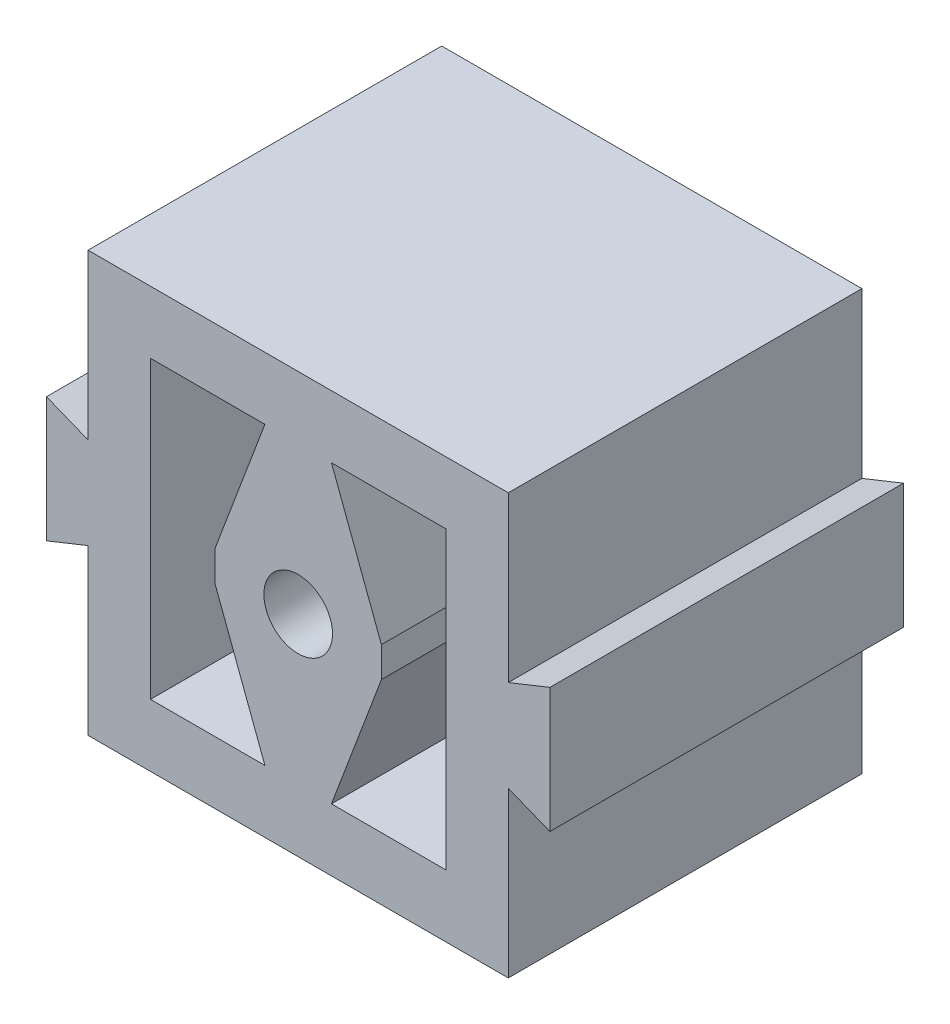
ISO-10303-21;
HEADER;
FILE_DESCRIPTION(('STEP AP214'),'2;1');
FILE_NAME('part.step','',(''),(''),'','','');
FILE_SCHEMA(('AUTOMOTIVE_DESIGN { 1 0 10303 214 1 1 1 1 }'));
ENDSEC;
DATA;
#1=APPLICATION_CONTEXT('core data for automotive mechanical design processes');
#2=APPLICATION_PROTOCOL_DEFINITION('international standard','automotive_design',2000,#1);
#3=PRODUCT_CONTEXT('',#1,'mechanical');
#4=PRODUCT('Part','Part','',(#3));
#5=PRODUCT_RELATED_PRODUCT_CATEGORY('part','',(#4));
#6=PRODUCT_DEFINITION_FORMATION('','',#4);
#7=PRODUCT_DEFINITION_CONTEXT('part definition',#1,'design');
#8=PRODUCT_DEFINITION('design','',#6,#7);
#9=PRODUCT_DEFINITION_SHAPE('','',#8);
#10=(LENGTH_UNIT() NAMED_UNIT(*) SI_UNIT(.MILLI.,.METRE.));
#11=(NAMED_UNIT(*) PLANE_ANGLE_UNIT() SI_UNIT($,.RADIAN.));
#12=(NAMED_UNIT(*) SI_UNIT($,.STERADIAN.) SOLID_ANGLE_UNIT());
#13=UNCERTAINTY_MEASURE_WITH_UNIT(LENGTH_MEASURE(1.E-05),#10,'distance_accuracy_value','');
#14=(GEOMETRIC_REPRESENTATION_CONTEXT(3) GLOBAL_UNCERTAINTY_ASSIGNED_CONTEXT((#13)) GLOBAL_UNIT_ASSIGNED_CONTEXT((#10,
#11,#12)) REPRESENTATION_CONTEXT('',''));
#15=CARTESIAN_POINT('',(0.,0.,0.));
#16=DIRECTION('',(0.,0.,1.));
#17=DIRECTION('',(1.,0.,0.));
#18=AXIS2_PLACEMENT_3D('',#15,#16,#17);
#19=CARTESIAN_POINT('',(25.25,0.,42.5));
#20=DIRECTION('',(1.,0.,0.));
#21=DIRECTION('',(0.,0.,-1.));
#22=AXIS2_PLACEMENT_3D('',#19,#20,#21);
#23=PLANE('',#22);
#24=DIRECTION('',(0.,-1.,0.));
#25=VECTOR('',#24,1.);
#26=CARTESIAN_POINT('',(25.25,0.,0.));
#27=LINE('',#26,#25);
#28=CARTESIAN_POINT('',(25.25,25.25,0.));
#29=VERTEX_POINT('',#28);
#30=CARTESIAN_POINT('',(25.25,5.5,0.));
#31=VERTEX_POINT('',#30);
#32=EDGE_CURVE('E348',#29,#31,#27,.T.);
#33=ORIENTED_EDGE('',*,*,#32,.F.);
#34=DIRECTION('',(0.,0.,-1.));
#35=VECTOR('',#34,1.);
#36=CARTESIAN_POINT('',(25.25,25.25,42.5));
#37=LINE('',#36,#35);
#38=CARTESIAN_POINT('',(25.25,25.25,42.5));
#39=VERTEX_POINT('',#38);
#40=EDGE_CURVE('E422',#39,#29,#37,.T.);
#41=ORIENTED_EDGE('',*,*,#40,.F.);
#42=DIRECTION('',(0.,-1.,0.));
#43=VECTOR('',#42,1.);
#44=CARTESIAN_POINT('',(25.25,0.,42.5));
#45=LINE('',#44,#43);
#46=CARTESIAN_POINT('',(25.25,5.5,42.5));
#47=VERTEX_POINT('',#46);
#48=EDGE_CURVE('E309',#39,#47,#45,.T.);
#49=ORIENTED_EDGE('',*,*,#48,.T.);
#50=DIRECTION('',(0.,0.,-1.));
#51=VECTOR('',#50,1.);
#52=CARTESIAN_POINT('',(25.25,5.5,42.5));
#53=LINE('',#52,#51);
#54=EDGE_CURVE('E347',#47,#31,#53,.T.);
#55=ORIENTED_EDGE('',*,*,#54,.T.);
#56=EDGE_LOOP('',(#33,#41,#49,#55));
#57=FACE_BOUND('',#56,.T.);
#58=ADVANCED_FACE('F47',(#57),#23,.T.);
#59=CARTESIAN_POINT('',(0.,25.25,42.5));
#60=DIRECTION('',(0.,1.,0.));
#61=DIRECTION('',(0.,0.,1.));
#62=AXIS2_PLACEMENT_3D('',#59,#60,#61);
#63=PLANE('',#62);
#64=DIRECTION('',(1.,0.,0.));
#65=VECTOR('',#64,1.);
#66=CARTESIAN_POINT('',(0.,25.25,0.));
#67=LINE('',#66,#65);
#68=CARTESIAN_POINT('',(-25.25,25.25,0.));
#69=VERTEX_POINT('',#68);
#70=EDGE_CURVE('E352',#69,#29,#67,.T.);
#71=ORIENTED_EDGE('',*,*,#70,.F.);
#72=DIRECTION('',(0.,0.,-1.));
#73=VECTOR('',#72,1.);
#74=CARTESIAN_POINT('',(-25.25,25.25,42.5));
#75=LINE('',#74,#73);
#76=CARTESIAN_POINT('',(-25.25,25.25,42.5));
#77=VERTEX_POINT('',#76);
#78=EDGE_CURVE('E419',#77,#69,#75,.T.);
#79=ORIENTED_EDGE('',*,*,#78,.F.);
#80=DIRECTION('',(1.,0.,0.));
#81=VECTOR('',#80,1.);
#82=CARTESIAN_POINT('',(0.,25.25,42.5));
#83=LINE('',#82,#81);
#84=EDGE_CURVE('E313',#77,#39,#83,.T.);
#85=ORIENTED_EDGE('',*,*,#84,.T.);
#86=ORIENTED_EDGE('',*,*,#40,.T.);
#87=EDGE_LOOP('',(#71,#79,#85,#86));
#88=FACE_BOUND('',#87,.T.);
#89=ADVANCED_FACE('F49',(#88),#63,.T.);
#90=CARTESIAN_POINT('',(-25.25,0.,42.5));
#91=DIRECTION('',(1.,0.,0.));
#92=DIRECTION('',(0.,0.,-1.));
#93=AXIS2_PLACEMENT_3D('',#90,#91,#92);
#94=PLANE('',#93);
#95=DIRECTION('',(0.,-1.,0.));
#96=VECTOR('',#95,1.);
#97=CARTESIAN_POINT('',(-25.25,0.,0.));
#98=LINE('',#97,#96);
#99=CARTESIAN_POINT('',(-25.25,5.5,0.));
#100=VERTEX_POINT('',#99);
#101=EDGE_CURVE('E357',#69,#100,#98,.T.);
#102=ORIENTED_EDGE('',*,*,#101,.T.);
#103=DIRECTION('',(0.,0.,-1.));
#104=VECTOR('',#103,1.);
#105=CARTESIAN_POINT('',(-25.25,5.5,42.5));
#106=LINE('',#105,#104);
#107=CARTESIAN_POINT('',(-25.25,5.5,42.5));
#108=VERTEX_POINT('',#107);
#109=EDGE_CURVE('E415',#108,#100,#106,.T.);
#110=ORIENTED_EDGE('',*,*,#109,.F.);
#111=DIRECTION('',(0.,-1.,0.));
#112=VECTOR('',#111,1.);
#113=CARTESIAN_POINT('',(-25.25,0.,42.5));
#114=LINE('',#113,#112);
#115=EDGE_CURVE('E319',#77,#108,#114,.T.);
#116=ORIENTED_EDGE('',*,*,#115,.F.);
#117=ORIENTED_EDGE('',*,*,#78,.T.);
#118=EDGE_LOOP('',(#102,#110,#116,#117));
#119=FACE_BOUND('',#118,.T.);
#120=ADVANCED_FACE('F501',(#119),#94,.F.);
#121=CARTESIAN_POINT('',(-1.58620689655175,-3.96551724137935,42.5));
#122=DIRECTION('',(-0.371390676354105,-0.928476690885259,0.));
#123=DIRECTION('',(0.928476690885259,-0.371390676354105,0.));
#124=AXIS2_PLACEMENT_3D('',#121,#122,#123);
#125=PLANE('',#124);
#126=DIRECTION('',(-0.928476690885259,0.371390676354105,0.));
#127=VECTOR('',#126,1.);
#128=CARTESIAN_POINT('',(-1.58620689655175,-3.96551724137935,0.));
#129=LINE('',#128,#127);
#130=CARTESIAN_POINT('',(-30.25,7.50000000000001,0.));
#131=VERTEX_POINT('',#130);
#132=EDGE_CURVE('E360',#100,#131,#129,.T.);
#133=ORIENTED_EDGE('',*,*,#132,.T.);
#134=DIRECTION('',(0.,0.,-1.));
#135=VECTOR('',#134,1.);
#136=CARTESIAN_POINT('',(-30.25,7.50000000000001,42.5));
#137=LINE('',#136,#135);
#138=CARTESIAN_POINT('',(-30.25,7.50000000000001,42.5));
#139=VERTEX_POINT('',#138);
#140=EDGE_CURVE('E411',#139,#131,#137,.T.);
#141=ORIENTED_EDGE('',*,*,#140,.F.);
#142=DIRECTION('',(-0.928476690885259,0.371390676354105,0.));
#143=VECTOR('',#142,1.);
#144=CARTESIAN_POINT('',(-1.58620689655175,-3.96551724137935,42.5));
#145=LINE('',#144,#143);
#146=EDGE_CURVE('E322',#108,#139,#145,.T.);
#147=ORIENTED_EDGE('',*,*,#146,.F.);
#148=ORIENTED_EDGE('',*,*,#109,.T.);
#149=EDGE_LOOP('',(#133,#141,#147,#148));
#150=FACE_BOUND('',#149,.T.);
#151=ADVANCED_FACE('F548',(#150),#125,.F.);
#152=CARTESIAN_POINT('',(-30.25,0.,42.5));
#153=DIRECTION('',(1.,0.,0.));
#154=DIRECTION('',(0.,0.,-1.));
#155=AXIS2_PLACEMENT_3D('',#152,#153,#154);
#156=PLANE('',#155);
#157=DIRECTION('',(0.,-1.,0.));
#158=VECTOR('',#157,1.);
#159=CARTESIAN_POINT('',(-30.25,0.,0.));
#160=LINE('',#159,#158);
#161=CARTESIAN_POINT('',(-30.25,-7.49999999999999,0.));
#162=VERTEX_POINT('',#161);
#163=EDGE_CURVE('E364',#131,#162,#160,.T.);
#164=ORIENTED_EDGE('',*,*,#163,.T.);
#165=DIRECTION('',(0.,0.,-1.));
#166=VECTOR('',#165,1.);
#167=CARTESIAN_POINT('',(-30.25,-7.49999999999999,42.5));
#168=LINE('',#167,#166);
#169=CARTESIAN_POINT('',(-30.25,-7.49999999999999,42.5));
#170=VERTEX_POINT('',#169);
#171=EDGE_CURVE('E407',#170,#162,#168,.T.);
#172=ORIENTED_EDGE('',*,*,#171,.F.);
#173=DIRECTION('',(0.,-1.,0.));
#174=VECTOR('',#173,1.);
#175=CARTESIAN_POINT('',(-30.25,0.,42.5));
#176=LINE('',#175,#174);
#177=EDGE_CURVE('E326',#139,#170,#176,.T.);
#178=ORIENTED_EDGE('',*,*,#177,.F.);
#179=ORIENTED_EDGE('',*,*,#140,.T.);
#180=EDGE_LOOP('',(#164,#172,#178,#179));
#181=FACE_BOUND('',#180,.T.);
#182=ADVANCED_FACE('F552',(#181),#156,.F.);
#183=CARTESIAN_POINT('',(-1.58620689655177,3.9655172413794,42.5));
#184=DIRECTION('',(-0.371390676354107,0.928476690885258,0.));
#185=DIRECTION('',(-0.928476690885258,-0.371390676354107,0.));
#186=AXIS2_PLACEMENT_3D('',#183,#184,#185);
#187=PLANE('',#186);
#188=DIRECTION('',(0.928476690885258,0.371390676354107,0.));
#189=VECTOR('',#188,1.);
#190=CARTESIAN_POINT('',(-1.58620689655177,3.9655172413794,0.));
#191=LINE('',#190,#189);
#192=CARTESIAN_POINT('',(-25.25,-5.49999999999998,0.));
#193=VERTEX_POINT('',#192);
#194=EDGE_CURVE('E367',#162,#193,#191,.T.);
#195=ORIENTED_EDGE('',*,*,#194,.T.);
#196=DIRECTION('',(0.,0.,-1.));
#197=VECTOR('',#196,1.);
#198=CARTESIAN_POINT('',(-25.25,-5.49999999999998,42.5));
#199=LINE('',#198,#197);
#200=CARTESIAN_POINT('',(-25.25,-5.49999999999998,42.5));
#201=VERTEX_POINT('',#200);
#202=EDGE_CURVE('E403',#201,#193,#199,.T.);
#203=ORIENTED_EDGE('',*,*,#202,.F.);
#204=DIRECTION('',(0.928476690885258,0.371390676354107,0.));
#205=VECTOR('',#204,1.);
#206=CARTESIAN_POINT('',(-1.58620689655177,3.9655172413794,42.5));
#207=LINE('',#206,#205);
#208=EDGE_CURVE('E329',#170,#201,#207,.T.);
#209=ORIENTED_EDGE('',*,*,#208,.F.);
#210=ORIENTED_EDGE('',*,*,#171,.T.);
#211=EDGE_LOOP('',(#195,#203,#209,#210));
#212=FACE_BOUND('',#211,.T.);
#213=ADVANCED_FACE('F557',(#212),#187,.F.);
#214=CARTESIAN_POINT('',(-25.25,-25.25,0.));
#215=VERTEX_POINT('',#214);
#216=EDGE_CURVE('E361',#193,#215,#98,.T.);
#217=ORIENTED_EDGE('',*,*,#216,.T.);
#218=DIRECTION('',(0.,0.,-1.));
#219=VECTOR('',#218,1.);
#220=CARTESIAN_POINT('',(-25.25,-25.25,42.5));
#221=LINE('',#220,#219);
#222=CARTESIAN_POINT('',(-25.25,-25.25,42.5));
#223=VERTEX_POINT('',#222);
#224=EDGE_CURVE('E399',#223,#215,#221,.T.);
#225=ORIENTED_EDGE('',*,*,#224,.F.);
#226=EDGE_CURVE('E323',#201,#223,#114,.T.);
#227=ORIENTED_EDGE('',*,*,#226,.F.);
#228=ORIENTED_EDGE('',*,*,#202,.T.);
#229=EDGE_LOOP('',(#217,#225,#227,#228));
#230=FACE_BOUND('',#229,.T.);
#231=ADVANCED_FACE('F516',(#230),#94,.F.);
#232=CARTESIAN_POINT('',(0.,-25.25,42.5));
#233=DIRECTION('',(0.,1.,0.));
#234=DIRECTION('',(0.,0.,1.));
#235=AXIS2_PLACEMENT_3D('',#232,#233,#234);
#236=PLANE('',#235);
#237=DIRECTION('',(1.,0.,0.));
#238=VECTOR('',#237,1.);
#239=CARTESIAN_POINT('',(0.,-25.25,0.));
#240=LINE('',#239,#238);
#241=CARTESIAN_POINT('',(25.25,-25.25,0.));
#242=VERTEX_POINT('',#241);
#243=EDGE_CURVE('E370',#215,#242,#240,.T.);
#244=ORIENTED_EDGE('',*,*,#243,.T.);
#245=DIRECTION('',(0.,0.,-1.));
#246=VECTOR('',#245,1.);
#247=CARTESIAN_POINT('',(25.25,-25.25,42.5));
#248=LINE('',#247,#246);
#249=CARTESIAN_POINT('',(25.25,-25.25,42.5));
#250=VERTEX_POINT('',#249);
#251=EDGE_CURVE('E396',#250,#242,#248,.T.);
#252=ORIENTED_EDGE('',*,*,#251,.F.);
#253=DIRECTION('',(1.,0.,0.));
#254=VECTOR('',#253,1.);
#255=CARTESIAN_POINT('',(0.,-25.25,42.5));
#256=LINE('',#255,#254);
#257=EDGE_CURVE('E332',#223,#250,#256,.T.);
#258=ORIENTED_EDGE('',*,*,#257,.F.);
#259=ORIENTED_EDGE('',*,*,#224,.T.);
#260=EDGE_LOOP('',(#244,#252,#258,#259));
#261=FACE_BOUND('',#260,.T.);
#262=ADVANCED_FACE('F508',(#261),#236,.F.);
#263=CARTESIAN_POINT('',(25.25,-5.49999999999999,0.));
#264=VERTEX_POINT('',#263);
#265=EDGE_CURVE('E353',#264,#242,#27,.T.);
#266=ORIENTED_EDGE('',*,*,#265,.F.);
#267=DIRECTION('',(0.,0.,-1.));
#268=VECTOR('',#267,1.);
#269=CARTESIAN_POINT('',(25.25,-5.49999999999999,42.5));
#270=LINE('',#269,#268);
#271=CARTESIAN_POINT('',(25.25,-5.49999999999999,42.5));
#272=VERTEX_POINT('',#271);
#273=EDGE_CURVE('E393',#272,#264,#270,.T.);
#274=ORIENTED_EDGE('',*,*,#273,.F.);
#275=EDGE_CURVE('E315',#272,#250,#45,.T.);
#276=ORIENTED_EDGE('',*,*,#275,.T.);
#277=ORIENTED_EDGE('',*,*,#251,.T.);
#278=EDGE_LOOP('',(#266,#274,#276,#277));
#279=FACE_BOUND('',#278,.T.);
#280=ADVANCED_FACE('F497',(#279),#23,.T.);
#281=CARTESIAN_POINT('',(1.58620689655175,3.96551724137935,42.5));
#282=DIRECTION('',(-0.371390676354105,-0.928476690885259,0.));
#283=DIRECTION('',(0.928476690885259,-0.371390676354105,0.));
#284=AXIS2_PLACEMENT_3D('',#281,#282,#283);
#285=PLANE('',#284);
#286=DIRECTION('',(-0.928476690885259,0.371390676354105,0.));
#287=VECTOR('',#286,1.);
#288=CARTESIAN_POINT('',(1.58620689655175,3.96551724137935,0.));
#289=LINE('',#288,#287);
#290=CARTESIAN_POINT('',(30.25,-7.5,0.));
#291=VERTEX_POINT('',#290);
#292=EDGE_CURVE('E374',#291,#264,#289,.T.);
#293=ORIENTED_EDGE('',*,*,#292,.F.);
#294=DIRECTION('',(0.,0.,-1.));
#295=VECTOR('',#294,1.);
#296=CARTESIAN_POINT('',(30.25,-7.5,42.5));
#297=LINE('',#296,#295);
#298=CARTESIAN_POINT('',(30.25,-7.5,42.5));
#299=VERTEX_POINT('',#298);
#300=EDGE_CURVE('E390',#299,#291,#297,.T.);
#301=ORIENTED_EDGE('',*,*,#300,.F.);
#302=DIRECTION('',(-0.928476690885259,0.371390676354105,0.));
#303=VECTOR('',#302,1.);
#304=CARTESIAN_POINT('',(1.58620689655175,3.96551724137935,42.5));
#305=LINE('',#304,#303);
#306=EDGE_CURVE('E335',#299,#272,#305,.T.);
#307=ORIENTED_EDGE('',*,*,#306,.T.);
#308=ORIENTED_EDGE('',*,*,#273,.T.);
#309=EDGE_LOOP('',(#293,#301,#307,#308));
#310=FACE_BOUND('',#309,.T.);
#311=ADVANCED_FACE('F507',(#310),#285,.T.);
#312=CARTESIAN_POINT('',(30.25,0.,42.5));
#313=DIRECTION('',(1.,0.,0.));
#314=DIRECTION('',(0.,0.,-1.));
#315=AXIS2_PLACEMENT_3D('',#312,#313,#314);
#316=PLANE('',#315);
#317=DIRECTION('',(0.,-1.,0.));
#318=VECTOR('',#317,1.);
#319=CARTESIAN_POINT('',(30.25,0.,0.));
#320=LINE('',#319,#318);
#321=CARTESIAN_POINT('',(30.25,7.5,0.));
#322=VERTEX_POINT('',#321);
#323=EDGE_CURVE('E378',#322,#291,#320,.T.);
#324=ORIENTED_EDGE('',*,*,#323,.F.);
#325=DIRECTION('',(0.,0.,-1.));
#326=VECTOR('',#325,1.);
#327=CARTESIAN_POINT('',(30.25,7.5,42.5));
#328=LINE('',#327,#326);
#329=CARTESIAN_POINT('',(30.25,7.5,42.5));
#330=VERTEX_POINT('',#329);
#331=EDGE_CURVE('E387',#330,#322,#328,.T.);
#332=ORIENTED_EDGE('',*,*,#331,.F.);
#333=DIRECTION('',(0.,-1.,0.));
#334=VECTOR('',#333,1.);
#335=CARTESIAN_POINT('',(30.25,0.,42.5));
#336=LINE('',#335,#334);
#337=EDGE_CURVE('E339',#330,#299,#336,.T.);
#338=ORIENTED_EDGE('',*,*,#337,.T.);
#339=ORIENTED_EDGE('',*,*,#300,.T.);
#340=EDGE_LOOP('',(#324,#332,#338,#339));
#341=FACE_BOUND('',#340,.T.);
#342=ADVANCED_FACE('F514',(#341),#316,.T.);
#343=CARTESIAN_POINT('',(1.58620689655172,-3.96551724137931,42.5));
#344=DIRECTION('',(-0.371390676354103,0.928476690885259,0.));
#345=DIRECTION('',(-0.928476690885259,-0.371390676354103,0.));
#346=AXIS2_PLACEMENT_3D('',#343,#344,#345);
#347=PLANE('',#346);
#348=DIRECTION('',(0.928476690885259,0.371390676354103,0.));
#349=VECTOR('',#348,1.);
#350=CARTESIAN_POINT('',(1.58620689655172,-3.96551724137931,0.));
#351=LINE('',#350,#349);
#352=EDGE_CURVE('E314',#31,#322,#351,.T.);
#353=ORIENTED_EDGE('',*,*,#352,.F.);
#354=ORIENTED_EDGE('',*,*,#54,.F.);
#355=DIRECTION('',(0.928476690885259,0.371390676354103,0.));
#356=VECTOR('',#355,1.);
#357=CARTESIAN_POINT('',(1.58620689655172,-3.96551724137931,42.5));
#358=LINE('',#357,#356);
#359=EDGE_CURVE('E343',#47,#330,#358,.T.);
#360=ORIENTED_EDGE('',*,*,#359,.T.);
#361=ORIENTED_EDGE('',*,*,#331,.T.);
#362=EDGE_LOOP('',(#353,#354,#360,#361));
#363=FACE_BOUND('',#362,.T.);
#364=ADVANCED_FACE('F536',(#363),#347,.T.);
#365=CARTESIAN_POINT('',(0.,0.,42.5));
#366=DIRECTION('',(0.,0.,1.));
#367=DIRECTION('',(1.,0.,0.));
#368=AXIS2_PLACEMENT_3D('',#365,#366,#367);
#369=PLANE('',#368);
#370=DIRECTION('',(1.,0.,0.));
#371=VECTOR('',#370,1.);
#372=CARTESIAN_POINT('',(-3.99999999999999,-17.75,42.5));
#373=LINE('',#372,#371);
#374=CARTESIAN_POINT('',(-17.75,-17.75,42.5));
#375=VERTEX_POINT('',#374);
#376=CARTESIAN_POINT('',(-3.99999999999999,-17.75,42.5));
#377=VERTEX_POINT('',#376);
#378=EDGE_CURVE('E63',#375,#377,#373,.T.);
#379=ORIENTED_EDGE('',*,*,#378,.F.);
#380=DIRECTION('',(0.,-1.,0.));
#381=VECTOR('',#380,1.);
#382=CARTESIAN_POINT('',(-17.75,-17.75,42.5));
#383=LINE('',#382,#381);
#384=CARTESIAN_POINT('',(-17.75,17.75,42.5));
#385=VERTEX_POINT('',#384);
#386=EDGE_CURVE('E247',#385,#375,#383,.T.);
#387=ORIENTED_EDGE('',*,*,#386,.F.);
#388=DIRECTION('',(-1.,0.,0.));
#389=VECTOR('',#388,1.);
#390=CARTESIAN_POINT('',(-17.75,17.75,42.5));
#391=LINE('',#390,#389);
#392=CARTESIAN_POINT('',(-4.,17.75,42.5));
#393=VERTEX_POINT('',#392);
#394=EDGE_CURVE('E240',#393,#385,#391,.T.);
#395=ORIENTED_EDGE('',*,*,#394,.F.);
#396=DIRECTION('',(0.352492473613771,0.935814648338892,0.));
#397=VECTOR('',#396,1.);
#398=CARTESIAN_POINT('',(-4.,17.75,42.5));
#399=LINE('',#398,#397);
#400=CARTESIAN_POINT('',(-9.99999999999999,1.82089991888554,42.5));
#401=VERTEX_POINT('',#400);
#402=EDGE_CURVE('E236',#401,#393,#399,.T.);
#403=ORIENTED_EDGE('',*,*,#402,.F.);
#404=DIRECTION('',(0.,1.,0.));
#405=VECTOR('',#404,1.);
#406=CARTESIAN_POINT('',(-9.99999999999999,1.82089991888554,42.5));
#407=LINE('',#406,#405);
#408=CARTESIAN_POINT('',(-10.,-1.82089991888554,42.5));
#409=VERTEX_POINT('',#408);
#410=EDGE_CURVE('E216',#409,#401,#407,.T.);
#411=ORIENTED_EDGE('',*,*,#410,.F.);
#412=DIRECTION('',(-0.352492473613771,0.935814648338892,0.));
#413=VECTOR('',#412,1.);
#414=CARTESIAN_POINT('',(-10.,-1.82089991888554,42.5));
#415=LINE('',#414,#413);
#416=EDGE_CURVE('E227',#377,#409,#415,.T.);
#417=ORIENTED_EDGE('',*,*,#416,.F.);
#418=EDGE_LOOP('',(#379,#387,#395,#403,#411,#417));
#419=FACE_BOUND('',#418,.T.);
#420=DIRECTION('',(0.,-1.,0.));
#421=VECTOR('',#420,1.);
#422=CARTESIAN_POINT('',(10.,1.82089991888554,42.5));
#423=LINE('',#422,#421);
#424=CARTESIAN_POINT('',(10.,1.82089991888554,42.5));
#425=VERTEX_POINT('',#424);
#426=CARTESIAN_POINT('',(10.,-1.82089991888554,42.5));
#427=VERTEX_POINT('',#426);
#428=EDGE_CURVE('E71',#425,#427,#423,.T.);
#429=ORIENTED_EDGE('',*,*,#428,.F.);
#430=DIRECTION('',(0.352492473613771,-0.935814648338892,0.));
#431=VECTOR('',#430,1.);
#432=CARTESIAN_POINT('',(4.,17.75,42.5));
#433=LINE('',#432,#431);
#434=CARTESIAN_POINT('',(4.,17.75,42.5));
#435=VERTEX_POINT('',#434);
#436=EDGE_CURVE('E268',#435,#425,#433,.T.);
#437=ORIENTED_EDGE('',*,*,#436,.F.);
#438=DIRECTION('',(-1.,0.,0.));
#439=VECTOR('',#438,1.);
#440=CARTESIAN_POINT('',(17.75,17.75,42.5));
#441=LINE('',#440,#439);
#442=CARTESIAN_POINT('',(17.75,17.75,42.5));
#443=VERTEX_POINT('',#442);
#444=EDGE_CURVE('E287',#443,#435,#441,.T.);
#445=ORIENTED_EDGE('',*,*,#444,.F.);
#446=DIRECTION('',(0.,1.,0.));
#447=VECTOR('',#446,1.);
#448=CARTESIAN_POINT('',(17.75,-17.75,42.5));
#449=LINE('',#448,#447);
#450=CARTESIAN_POINT('',(17.75,-17.75,42.5));
#451=VERTEX_POINT('',#450);
#452=EDGE_CURVE('E291',#451,#443,#449,.T.);
#453=ORIENTED_EDGE('',*,*,#452,.F.);
#454=DIRECTION('',(1.,0.,0.));
#455=VECTOR('',#454,1.);
#456=CARTESIAN_POINT('',(4.00000000000001,-17.75,42.5));
#457=LINE('',#456,#455);
#458=CARTESIAN_POINT('',(4.00000000000001,-17.75,42.5));
#459=VERTEX_POINT('',#458);
#460=EDGE_CURVE('E295',#459,#451,#457,.T.);
#461=ORIENTED_EDGE('',*,*,#460,.F.);
#462=DIRECTION('',(-0.352492473613771,-0.935814648338892,0.));
#463=VECTOR('',#462,1.);
#464=CARTESIAN_POINT('',(10.,-1.82089991888554,42.5));
#465=LINE('',#464,#463);
#466=EDGE_CURVE('E299',#427,#459,#465,.T.);
#467=ORIENTED_EDGE('',*,*,#466,.F.);
#468=EDGE_LOOP('',(#429,#437,#445,#453,#461,#467));
#469=FACE_BOUND('',#468,.T.);
#470=CARTESIAN_POINT('',(0.,0.,42.5));
#471=DIRECTION('',(0.,0.,1.));
#472=DIRECTION('',(1.,0.,0.));
#473=AXIS2_PLACEMENT_3D('',#470,#471,#472);
#474=CIRCLE('',#473,4.125);
#475=CARTESIAN_POINT('',(4.125,0.,42.5));
#476=VERTEX_POINT('',#475);
#477=EDGE_CURVE('E254',#476,#476,#474,.T.);
#478=ORIENTED_EDGE('',*,*,#477,.F.);
#479=EDGE_LOOP('',(#478));
#480=FACE_BOUND('',#479,.T.);
#481=ORIENTED_EDGE('',*,*,#48,.F.);
#482=ORIENTED_EDGE('',*,*,#84,.F.);
#483=ORIENTED_EDGE('',*,*,#115,.T.);
#484=ORIENTED_EDGE('',*,*,#146,.T.);
#485=ORIENTED_EDGE('',*,*,#177,.T.);
#486=ORIENTED_EDGE('',*,*,#208,.T.);
#487=ORIENTED_EDGE('',*,*,#226,.T.);
#488=ORIENTED_EDGE('',*,*,#257,.T.);
#489=ORIENTED_EDGE('',*,*,#275,.F.);
#490=ORIENTED_EDGE('',*,*,#306,.F.);
#491=ORIENTED_EDGE('',*,*,#337,.F.);
#492=ORIENTED_EDGE('',*,*,#359,.F.);
#493=EDGE_LOOP('',(#481,#482,#483,#484,#485,#486,#487,#488,#489,#490,#491,#492));
#494=FACE_BOUND('',#493,.T.);
#495=ADVANCED_FACE('F232',(#419,#469,#480,#494),#369,.T.);
#496=CARTESIAN_POINT('',(0.,0.,0.));
#497=DIRECTION('',(0.,0.,1.));
#498=DIRECTION('',(1.,0.,0.));
#499=AXIS2_PLACEMENT_3D('',#496,#497,#498);
#500=PLANE('',#499);
#501=DIRECTION('',(0.,-1.,0.));
#502=VECTOR('',#501,1.);
#503=CARTESIAN_POINT('',(-17.75,0.,0.));
#504=LINE('',#503,#502);
#505=CARTESIAN_POINT('',(-17.75,17.75,0.));
#506=VERTEX_POINT('',#505);
#507=CARTESIAN_POINT('',(-17.75,-17.75,0.));
#508=VERTEX_POINT('',#507);
#509=EDGE_CURVE('E56',#506,#508,#504,.T.);
#510=ORIENTED_EDGE('',*,*,#509,.T.);
#511=DIRECTION('',(1.,0.,0.));
#512=VECTOR('',#511,1.);
#513=CARTESIAN_POINT('',(0.,-17.75,0.));
#514=LINE('',#513,#512);
#515=CARTESIAN_POINT('',(-3.99999999999999,-17.75,0.));
#516=VERTEX_POINT('',#515);
#517=EDGE_CURVE('E11',#508,#516,#514,.T.);
#518=ORIENTED_EDGE('',*,*,#517,.T.);
#519=DIRECTION('',(-0.352492473613771,0.935814648338892,0.));
#520=VECTOR('',#519,1.);
#521=CARTESIAN_POINT('',(-9.35814648338892,-3.52492473613771,0.));
#522=LINE('',#521,#520);
#523=CARTESIAN_POINT('',(-10.,-1.82089991888554,0.));
#524=VERTEX_POINT('',#523);
#525=EDGE_CURVE('E452',#516,#524,#522,.T.);
#526=ORIENTED_EDGE('',*,*,#525,.T.);
#527=DIRECTION('',(0.,1.,0.));
#528=VECTOR('',#527,1.);
#529=CARTESIAN_POINT('',(-9.99999999999999,0.,0.));
#530=LINE('',#529,#528);
#531=CARTESIAN_POINT('',(-9.99999999999999,1.82089991888554,0.));
#532=VERTEX_POINT('',#531);
#533=EDGE_CURVE('E219',#524,#532,#530,.T.);
#534=ORIENTED_EDGE('',*,*,#533,.T.);
#535=DIRECTION('',(0.352492473613771,0.935814648338893,0.));
#536=VECTOR('',#535,1.);
#537=CARTESIAN_POINT('',(-9.35814648338892,3.52492473613771,0.));
#538=LINE('',#537,#536);
#539=CARTESIAN_POINT('',(-4.,17.75,0.));
#540=VERTEX_POINT('',#539);
#541=EDGE_CURVE('E457',#532,#540,#538,.T.);
#542=ORIENTED_EDGE('',*,*,#541,.T.);
#543=DIRECTION('',(-1.,0.,0.));
#544=VECTOR('',#543,1.);
#545=CARTESIAN_POINT('',(0.,17.75,0.));
#546=LINE('',#545,#544);
#547=EDGE_CURVE('E461',#540,#506,#546,.T.);
#548=ORIENTED_EDGE('',*,*,#547,.T.);
#549=EDGE_LOOP('',(#510,#518,#526,#534,#542,#548));
#550=FACE_BOUND('',#549,.T.);
#551=DIRECTION('',(0.352492473613771,-0.935814648338892,0.));
#552=VECTOR('',#551,1.);
#553=CARTESIAN_POINT('',(9.35814648338893,3.52492473613771,0.));
#554=LINE('',#553,#552);
#555=CARTESIAN_POINT('',(4.,17.75,0.));
#556=VERTEX_POINT('',#555);
#557=CARTESIAN_POINT('',(10.,1.82089991888554,0.));
#558=VERTEX_POINT('',#557);
#559=EDGE_CURVE('E444',#556,#558,#554,.T.);
#560=ORIENTED_EDGE('',*,*,#559,.T.);
#561=DIRECTION('',(0.,-1.,0.));
#562=VECTOR('',#561,1.);
#563=CARTESIAN_POINT('',(10.,0.,0.));
#564=LINE('',#563,#562);
#565=CARTESIAN_POINT('',(10.,-1.82089991888554,0.));
#566=VERTEX_POINT('',#565);
#567=EDGE_CURVE('E448',#558,#566,#564,.T.);
#568=ORIENTED_EDGE('',*,*,#567,.T.);
#569=DIRECTION('',(-0.352492473613771,-0.935814648338893,0.));
#570=VECTOR('',#569,1.);
#571=CARTESIAN_POINT('',(9.35814648338893,-3.52492473613771,0.));
#572=LINE('',#571,#570);
#573=CARTESIAN_POINT('',(4.,-17.75,0.));
#574=VERTEX_POINT('',#573);
#575=EDGE_CURVE('E425',#566,#574,#572,.T.);
#576=ORIENTED_EDGE('',*,*,#575,.T.);
#577=DIRECTION('',(1.,0.,0.));
#578=VECTOR('',#577,1.);
#579=CARTESIAN_POINT('',(0.,-17.75,0.));
#580=LINE('',#579,#578);
#581=CARTESIAN_POINT('',(17.75,-17.75,0.));
#582=VERTEX_POINT('',#581);
#583=EDGE_CURVE('E432',#574,#582,#580,.T.);
#584=ORIENTED_EDGE('',*,*,#583,.T.);
#585=DIRECTION('',(0.,1.,0.));
#586=VECTOR('',#585,1.);
#587=CARTESIAN_POINT('',(17.75,0.,0.));
#588=LINE('',#587,#586);
#589=CARTESIAN_POINT('',(17.75,17.75,0.));
#590=VERTEX_POINT('',#589);
#591=EDGE_CURVE('E436',#582,#590,#588,.T.);
#592=ORIENTED_EDGE('',*,*,#591,.T.);
#593=DIRECTION('',(-1.,0.,0.));
#594=VECTOR('',#593,1.);
#595=CARTESIAN_POINT('',(0.,17.75,0.));
#596=LINE('',#595,#594);
#597=EDGE_CURVE('E440',#590,#556,#596,.T.);
#598=ORIENTED_EDGE('',*,*,#597,.T.);
#599=EDGE_LOOP('',(#560,#568,#576,#584,#592,#598));
#600=FACE_BOUND('',#599,.T.);
#601=CARTESIAN_POINT('',(0.,0.,0.));
#602=DIRECTION('',(0.,0.,1.));
#603=DIRECTION('',(1.,0.,0.));
#604=AXIS2_PLACEMENT_3D('',#601,#602,#603);
#605=CIRCLE('',#604,4.125);
#606=CARTESIAN_POINT('',(4.125,0.,0.));
#607=VERTEX_POINT('',#606);
#608=EDGE_CURVE('E308',#607,#607,#605,.T.);
#609=ORIENTED_EDGE('',*,*,#608,.T.);
#610=EDGE_LOOP('',(#609));
#611=FACE_BOUND('',#610,.T.);
#612=ORIENTED_EDGE('',*,*,#32,.T.);
#613=ORIENTED_EDGE('',*,*,#352,.T.);
#614=ORIENTED_EDGE('',*,*,#323,.T.);
#615=ORIENTED_EDGE('',*,*,#292,.T.);
#616=ORIENTED_EDGE('',*,*,#265,.T.);
#617=ORIENTED_EDGE('',*,*,#243,.F.);
#618=ORIENTED_EDGE('',*,*,#216,.F.);
#619=ORIENTED_EDGE('',*,*,#194,.F.);
#620=ORIENTED_EDGE('',*,*,#163,.F.);
#621=ORIENTED_EDGE('',*,*,#132,.F.);
#622=ORIENTED_EDGE('',*,*,#101,.F.);
#623=ORIENTED_EDGE('',*,*,#70,.T.);
#624=EDGE_LOOP('',(#612,#613,#614,#615,#616,#617,#618,#619,#620,#621,#622,#623));
#625=FACE_BOUND('',#624,.T.);
#626=ADVANCED_FACE('F467',(#550,#600,#611,#625),#500,.F.);
#627=CARTESIAN_POINT('',(0.,0.,-3.7));
#628=DIRECTION('',(0.,0.,1.));
#629=DIRECTION('',(1.,0.,0.));
#630=AXIS2_PLACEMENT_3D('',#627,#628,#629);
#631=CYLINDRICAL_SURFACE('',#630,4.125);
#632=ORIENTED_EDGE('',*,*,#477,.T.);
#633=EDGE_LOOP('',(#632));
#634=FACE_BOUND('',#633,.T.);
#635=ORIENTED_EDGE('',*,*,#608,.F.);
#636=EDGE_LOOP('',(#635));
#637=FACE_BOUND('',#636,.T.);
#638=ADVANCED_FACE('F654',(#634,#637),#631,.F.);
#639=CARTESIAN_POINT('',(10.,1.82089991888554,-33.5));
#640=DIRECTION('',(-1.,0.,0.));
#641=DIRECTION('',(0.,-1.,0.));
#642=AXIS2_PLACEMENT_3D('',#639,#640,#641);
#643=PLANE('',#642);
#644=DIRECTION('',(0.,0.,1.));
#645=VECTOR('',#644,1.);
#646=CARTESIAN_POINT('',(10.,1.82089991888554,-33.5));
#647=LINE('',#646,#645);
#648=EDGE_CURVE('E281',#558,#425,#647,.T.);
#649=ORIENTED_EDGE('',*,*,#648,.T.);
#650=ORIENTED_EDGE('',*,*,#428,.T.);
#651=DIRECTION('',(0.,0.,1.));
#652=VECTOR('',#651,1.);
#653=CARTESIAN_POINT('',(10.,-1.82089991888554,-33.5));
#654=LINE('',#653,#652);
#655=EDGE_CURVE('E265',#566,#427,#654,.T.);
#656=ORIENTED_EDGE('',*,*,#655,.F.);
#657=ORIENTED_EDGE('',*,*,#567,.F.);
#658=EDGE_LOOP('',(#649,#650,#656,#657));
#659=FACE_BOUND('',#658,.T.);
#660=ADVANCED_FACE('F669',(#659),#643,.F.);
#661=CARTESIAN_POINT('',(4.,17.75,-33.5));
#662=DIRECTION('',(-0.935814648338892,-0.352492473613771,0.));
#663=DIRECTION('',(0.352492473613771,-0.935814648338892,0.));
#664=AXIS2_PLACEMENT_3D('',#661,#662,#663);
#665=PLANE('',#664);
#666=DIRECTION('',(0.,0.,1.));
#667=VECTOR('',#666,1.);
#668=CARTESIAN_POINT('',(4.,17.75,-33.5));
#669=LINE('',#668,#667);
#670=EDGE_CURVE('E278',#556,#435,#669,.T.);
#671=ORIENTED_EDGE('',*,*,#670,.T.);
#672=ORIENTED_EDGE('',*,*,#436,.T.);
#673=ORIENTED_EDGE('',*,*,#648,.F.);
#674=ORIENTED_EDGE('',*,*,#559,.F.);
#675=EDGE_LOOP('',(#671,#672,#673,#674));
#676=FACE_BOUND('',#675,.T.);
#677=ADVANCED_FACE('F678',(#676),#665,.F.);
#678=CARTESIAN_POINT('',(17.75,17.75,-33.5));
#679=DIRECTION('',(0.,1.,0.));
#680=DIRECTION('',(-1.,0.,0.));
#681=AXIS2_PLACEMENT_3D('',#678,#679,#680);
#682=PLANE('',#681);
#683=DIRECTION('',(0.,0.,1.));
#684=VECTOR('',#683,1.);
#685=CARTESIAN_POINT('',(17.75,17.75,-33.5));
#686=LINE('',#685,#684);
#687=EDGE_CURVE('E275',#590,#443,#686,.T.);
#688=ORIENTED_EDGE('',*,*,#687,.T.);
#689=ORIENTED_EDGE('',*,*,#444,.T.);
#690=ORIENTED_EDGE('',*,*,#670,.F.);
#691=ORIENTED_EDGE('',*,*,#597,.F.);
#692=EDGE_LOOP('',(#688,#689,#690,#691));
#693=FACE_BOUND('',#692,.T.);
#694=ADVANCED_FACE('F686',(#693),#682,.F.);
#695=CARTESIAN_POINT('',(17.75,-17.75,-33.5));
#696=DIRECTION('',(1.,0.,0.));
#697=DIRECTION('',(0.,1.,0.));
#698=AXIS2_PLACEMENT_3D('',#695,#696,#697);
#699=PLANE('',#698);
#700=DIRECTION('',(0.,0.,1.));
#701=VECTOR('',#700,1.);
#702=CARTESIAN_POINT('',(17.75,-17.75,-33.5));
#703=LINE('',#702,#701);
#704=EDGE_CURVE('E272',#582,#451,#703,.T.);
#705=ORIENTED_EDGE('',*,*,#704,.T.);
#706=ORIENTED_EDGE('',*,*,#452,.T.);
#707=ORIENTED_EDGE('',*,*,#687,.F.);
#708=ORIENTED_EDGE('',*,*,#591,.F.);
#709=EDGE_LOOP('',(#705,#706,#707,#708));
#710=FACE_BOUND('',#709,.T.);
#711=ADVANCED_FACE('F696',(#710),#699,.F.);
#712=CARTESIAN_POINT('',(4.00000000000001,-17.75,-33.5));
#713=DIRECTION('',(0.,-1.,0.));
#714=DIRECTION('',(1.,0.,0.));
#715=AXIS2_PLACEMENT_3D('',#712,#713,#714);
#716=PLANE('',#715);
#717=DIRECTION('',(0.,0.,1.));
#718=VECTOR('',#717,1.);
#719=CARTESIAN_POINT('',(4.00000000000001,-17.75,-33.5));
#720=LINE('',#719,#718);
#721=EDGE_CURVE('E269',#574,#459,#720,.T.);
#722=ORIENTED_EDGE('',*,*,#721,.T.);
#723=ORIENTED_EDGE('',*,*,#460,.T.);
#724=ORIENTED_EDGE('',*,*,#704,.F.);
#725=ORIENTED_EDGE('',*,*,#583,.F.);
#726=EDGE_LOOP('',(#722,#723,#724,#725));
#727=FACE_BOUND('',#726,.T.);
#728=ADVANCED_FACE('F489',(#727),#716,.F.);
#729=CARTESIAN_POINT('',(10.,-1.82089991888554,-33.5));
#730=DIRECTION('',(-0.935814648338892,0.352492473613771,0.));
#731=DIRECTION('',(-0.352492473613771,-0.935814648338893,0.));
#732=AXIS2_PLACEMENT_3D('',#729,#730,#731);
#733=PLANE('',#732);
#734=ORIENTED_EDGE('',*,*,#655,.T.);
#735=ORIENTED_EDGE('',*,*,#466,.T.);
#736=ORIENTED_EDGE('',*,*,#721,.F.);
#737=ORIENTED_EDGE('',*,*,#575,.F.);
#738=EDGE_LOOP('',(#734,#735,#736,#737));
#739=FACE_BOUND('',#738,.T.);
#740=ADVANCED_FACE('F482',(#739),#733,.F.);
#741=CARTESIAN_POINT('',(-3.99999999999999,-17.75,-33.5));
#742=DIRECTION('',(0.,-1.,0.));
#743=DIRECTION('',(1.,0.,0.));
#744=AXIS2_PLACEMENT_3D('',#741,#742,#743);
#745=PLANE('',#744);
#746=DIRECTION('',(0.,0.,1.));
#747=VECTOR('',#746,1.);
#748=CARTESIAN_POINT('',(-17.75,-17.75,-33.5));
#749=LINE('',#748,#747);
#750=EDGE_CURVE('E251',#508,#375,#749,.T.);
#751=ORIENTED_EDGE('',*,*,#750,.T.);
#752=ORIENTED_EDGE('',*,*,#378,.T.);
#753=DIRECTION('',(0.,0.,1.));
#754=VECTOR('',#753,1.);
#755=CARTESIAN_POINT('',(-3.99999999999999,-17.75,-33.5));
#756=LINE('',#755,#754);
#757=EDGE_CURVE('E224',#516,#377,#756,.T.);
#758=ORIENTED_EDGE('',*,*,#757,.F.);
#759=ORIENTED_EDGE('',*,*,#517,.F.);
#760=EDGE_LOOP('',(#751,#752,#758,#759));
#761=FACE_BOUND('',#760,.T.);
#762=ADVANCED_FACE('F480',(#761),#745,.F.);
#763=CARTESIAN_POINT('',(-17.75,-17.75,-33.5));
#764=DIRECTION('',(-1.,0.,0.));
#765=DIRECTION('',(0.,0.,1.));
#766=AXIS2_PLACEMENT_3D('',#763,#764,#765);
#767=PLANE('',#766);
#768=DIRECTION('',(0.,0.,1.));
#769=VECTOR('',#768,1.);
#770=CARTESIAN_POINT('',(-17.75,17.75,-33.5));
#771=LINE('',#770,#769);
#772=EDGE_CURVE('E255',#506,#385,#771,.T.);
#773=ORIENTED_EDGE('',*,*,#772,.T.);
#774=ORIENTED_EDGE('',*,*,#386,.T.);
#775=ORIENTED_EDGE('',*,*,#750,.F.);
#776=ORIENTED_EDGE('',*,*,#509,.F.);
#777=EDGE_LOOP('',(#773,#774,#775,#776));
#778=FACE_BOUND('',#777,.T.);
#779=ADVANCED_FACE('F472',(#778),#767,.F.);
#780=CARTESIAN_POINT('',(-17.75,17.75,-33.5));
#781=DIRECTION('',(0.,1.,0.));
#782=DIRECTION('',(-1.,0.,0.));
#783=AXIS2_PLACEMENT_3D('',#780,#781,#782);
#784=PLANE('',#783);
#785=DIRECTION('',(0.,0.,1.));
#786=VECTOR('',#785,1.);
#787=CARTESIAN_POINT('',(-4.,17.75,-33.5));
#788=LINE('',#787,#786);
#789=EDGE_CURVE('E258',#540,#393,#788,.T.);
#790=ORIENTED_EDGE('',*,*,#789,.T.);
#791=ORIENTED_EDGE('',*,*,#394,.T.);
#792=ORIENTED_EDGE('',*,*,#772,.F.);
#793=ORIENTED_EDGE('',*,*,#547,.F.);
#794=EDGE_LOOP('',(#790,#791,#792,#793));
#795=FACE_BOUND('',#794,.T.);
#796=ADVANCED_FACE('F474',(#795),#784,.F.);
#797=CARTESIAN_POINT('',(-4.,17.75,-33.5));
#798=DIRECTION('',(0.935814648338892,-0.352492473613771,0.));
#799=DIRECTION('',(0.352492473613771,0.935814648338893,0.));
#800=AXIS2_PLACEMENT_3D('',#797,#798,#799);
#801=PLANE('',#800);
#802=DIRECTION('',(0.,0.,1.));
#803=VECTOR('',#802,1.);
#804=CARTESIAN_POINT('',(-9.99999999999999,1.82089991888554,-33.5));
#805=LINE('',#804,#803);
#806=EDGE_CURVE('E223',#532,#401,#805,.T.);
#807=ORIENTED_EDGE('',*,*,#806,.T.);
#808=ORIENTED_EDGE('',*,*,#402,.T.);
#809=ORIENTED_EDGE('',*,*,#789,.F.);
#810=ORIENTED_EDGE('',*,*,#541,.F.);
#811=EDGE_LOOP('',(#807,#808,#809,#810));
#812=FACE_BOUND('',#811,.T.);
#813=ADVANCED_FACE('F479',(#812),#801,.F.);
#814=CARTESIAN_POINT('',(-9.99999999999999,1.82089991888554,-33.5));
#815=DIRECTION('',(1.,0.,0.));
#816=DIRECTION('',(0.,1.,0.));
#817=AXIS2_PLACEMENT_3D('',#814,#815,#816);
#818=PLANE('',#817);
#819=DIRECTION('',(0.,0.,1.));
#820=VECTOR('',#819,1.);
#821=CARTESIAN_POINT('',(-10.,-1.82089991888554,-33.5));
#822=LINE('',#821,#820);
#823=EDGE_CURVE('E211',#524,#409,#822,.T.);
#824=ORIENTED_EDGE('',*,*,#823,.T.);
#825=ORIENTED_EDGE('',*,*,#410,.T.);
#826=ORIENTED_EDGE('',*,*,#806,.F.);
#827=ORIENTED_EDGE('',*,*,#533,.F.);
#828=EDGE_LOOP('',(#824,#825,#826,#827));
#829=FACE_BOUND('',#828,.T.);
#830=ADVANCED_FACE('F213',(#829),#818,.F.);
#831=CARTESIAN_POINT('',(-10.,-1.82089991888554,-33.5));
#832=DIRECTION('',(0.935814648338892,0.352492473613771,0.));
#833=DIRECTION('',(-0.352492473613771,0.935814648338892,0.));
#834=AXIS2_PLACEMENT_3D('',#831,#832,#833);
#835=PLANE('',#834);
#836=ORIENTED_EDGE('',*,*,#757,.T.);
#837=ORIENTED_EDGE('',*,*,#416,.T.);
#838=ORIENTED_EDGE('',*,*,#823,.F.);
#839=ORIENTED_EDGE('',*,*,#525,.F.);
#840=EDGE_LOOP('',(#836,#837,#838,#839));
#841=FACE_BOUND('',#840,.T.);
#842=ADVANCED_FACE('F228',(#841),#835,.F.);
#843=CLOSED_SHELL('',(#58,#89,#120,#151,#182,#213,#231,#262,#280,#311,#342,#364,#495,#626,#638,
#660,#677,#694,#711,#728,#740,#762,#779,#796,#813,#830,#842));
#844=MANIFOLD_SOLID_BREP('B2',#843);
#845=ADVANCED_BREP_SHAPE_REPRESENTATION('',(#18,#844),#14);
#846=SHAPE_DEFINITION_REPRESENTATION(#9,#845);
ENDSEC;
END-ISO-10303-21;
